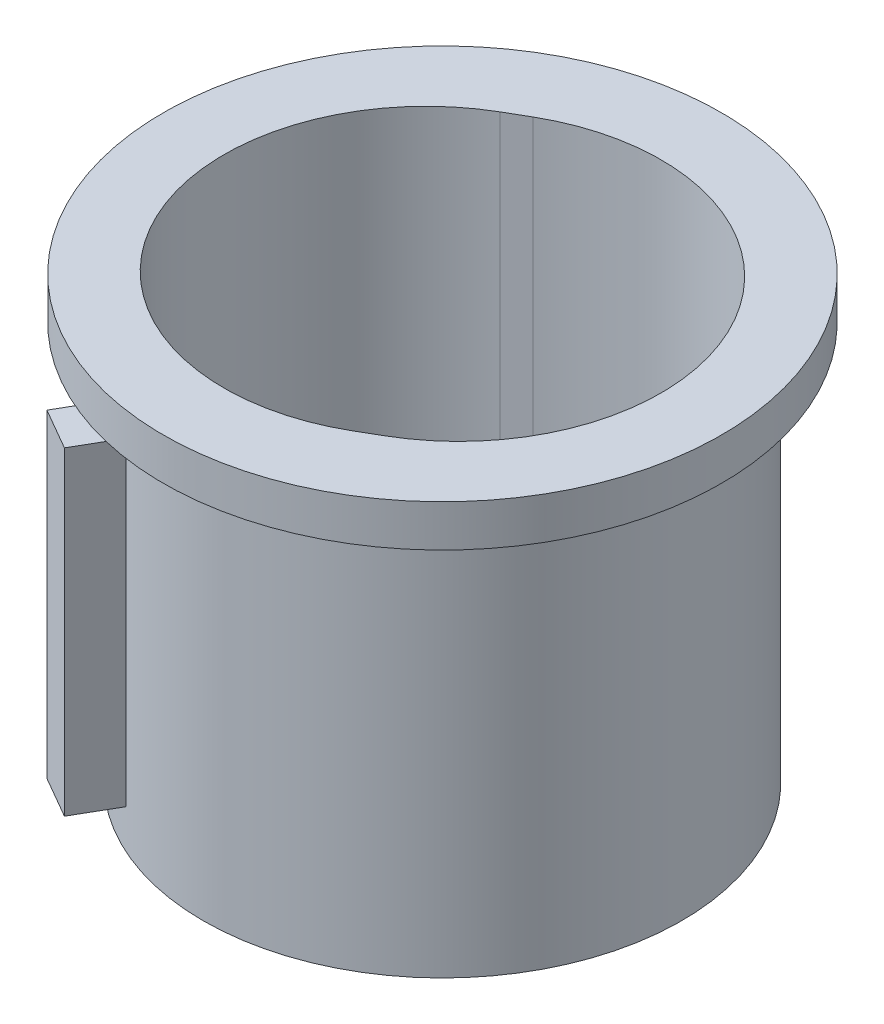
ISO-10303-21;
HEADER;
FILE_DESCRIPTION(('STEP AP214'),'2;1');
FILE_NAME('part.step','',(''),(''),'','','');
FILE_SCHEMA(('AUTOMOTIVE_DESIGN { 1 0 10303 214 1 1 1 1 }'));
ENDSEC;
DATA;
#1=APPLICATION_CONTEXT('core data for automotive mechanical design processes');
#2=APPLICATION_PROTOCOL_DEFINITION('international standard','automotive_design',2000,#1);
#3=PRODUCT_CONTEXT('',#1,'mechanical');
#4=PRODUCT('Part','Part','',(#3));
#5=PRODUCT_RELATED_PRODUCT_CATEGORY('part','',(#4));
#6=PRODUCT_DEFINITION_FORMATION('','',#4);
#7=PRODUCT_DEFINITION_CONTEXT('part definition',#1,'design');
#8=PRODUCT_DEFINITION('design','',#6,#7);
#9=PRODUCT_DEFINITION_SHAPE('','',#8);
#10=(LENGTH_UNIT() NAMED_UNIT(*) SI_UNIT(.MILLI.,.METRE.));
#11=(NAMED_UNIT(*) PLANE_ANGLE_UNIT() SI_UNIT($,.RADIAN.));
#12=(NAMED_UNIT(*) SI_UNIT($,.STERADIAN.) SOLID_ANGLE_UNIT());
#13=UNCERTAINTY_MEASURE_WITH_UNIT(LENGTH_MEASURE(1.E-05),#10,'distance_accuracy_value','');
#14=(GEOMETRIC_REPRESENTATION_CONTEXT(3) GLOBAL_UNCERTAINTY_ASSIGNED_CONTEXT((#13)) GLOBAL_UNIT_ASSIGNED_CONTEXT((#10,
#11,#12)) REPRESENTATION_CONTEXT('',''));
#15=CARTESIAN_POINT('',(0.,0.,0.));
#16=DIRECTION('',(0.,0.,1.));
#17=DIRECTION('',(1.,0.,0.));
#18=AXIS2_PLACEMENT_3D('',#15,#16,#17);
#19=CARTESIAN_POINT('',(-74.2916512459885,-105.98,31.1769145362398));
#20=DIRECTION('',(0.,1.,0.));
#21=DIRECTION('',(-0.866025403784439,0.,-0.5));
#22=AXIS2_PLACEMENT_3D('',#19,#20,#21);
#23=PLANE('',#22);
#24=CARTESIAN_POINT('',(-74.2916512459885,-105.98,31.1769145362398));
#25=DIRECTION('',(0.,1.,0.));
#26=DIRECTION('',(-0.866025403784439,0.,-0.5));
#27=AXIS2_PLACEMENT_3D('',#24,#25,#26);
#28=CIRCLE('',#27,6.);
#29=CARTESIAN_POINT('',(-79.4878036686952,-105.98,28.1769145362398));
#30=VERTEX_POINT('',#29);
#31=EDGE_CURVE('E159',#30,#30,#28,.T.);
#32=ORIENTED_EDGE('',*,*,#31,.F.);
#33=EDGE_LOOP('',(#32));
#34=FACE_BOUND('',#33,.T.);
#35=CARTESIAN_POINT('',(-74.0318436248532,-105.98,31.0269145362398));
#36=DIRECTION('',(0.,1.,0.));
#37=DIRECTION('',(-0.866025403784439,0.,-0.5));
#38=AXIS2_PLACEMENT_3D('',#35,#36,#37);
#39=CIRCLE('',#38,5.07);
#40=CARTESIAN_POINT('',(-76.5668436248532,-105.98,26.6361657390527));
#41=VERTEX_POINT('',#40);
#42=CARTESIAN_POINT('',(-71.4968436248532,-105.98,35.4176633334269));
#43=VERTEX_POINT('',#42);
#44=EDGE_CURVE('E146',#41,#43,#39,.F.);
#45=ORIENTED_EDGE('',*,*,#44,.F.);
#46=DIRECTION('',(0.866025403784439,0.,-0.499999999999999));
#47=VECTOR('',#46,1.);
#48=CARTESIAN_POINT('',(-76.8266512459885,-105.98,26.7861657390527));
#49=LINE('',#48,#47);
#50=CARTESIAN_POINT('',(-77.0864588671238,-105.98,26.9361657390527));
#51=VERTEX_POINT('',#50);
#52=EDGE_CURVE('E150',#51,#41,#49,.T.);
#53=ORIENTED_EDGE('',*,*,#52,.F.);
#54=CARTESIAN_POINT('',(-74.5514588671238,-105.98,31.3269145362398));
#55=DIRECTION('',(0.,1.,0.));
#56=DIRECTION('',(-0.866025403784439,0.,-0.5));
#57=AXIS2_PLACEMENT_3D('',#54,#55,#56);
#58=CIRCLE('',#57,5.07);
#59=CARTESIAN_POINT('',(-72.0164588671238,-105.98,35.7176633334269));
#60=VERTEX_POINT('',#59);
#61=EDGE_CURVE('E143',#60,#51,#58,.F.);
#62=ORIENTED_EDGE('',*,*,#61,.F.);
#63=DIRECTION('',(-0.866025403784439,0.,0.499999999999999));
#64=VECTOR('',#63,1.);
#65=CARTESIAN_POINT('',(-71.7566512459885,-105.98,35.5676633334269));
#66=LINE('',#65,#64);
#67=EDGE_CURVE('E141',#43,#60,#66,.T.);
#68=ORIENTED_EDGE('',*,*,#67,.F.);
#69=EDGE_LOOP('',(#45,#53,#62,#68));
#70=FACE_BOUND('',#69,.T.);
#71=ADVANCED_FACE('F41',(#34,#70),#23,.F.);
#72=CARTESIAN_POINT('',(-74.2916512459885,-94.93,31.1769145362398));
#73=DIRECTION('',(0.,1.,0.));
#74=DIRECTION('',(-0.866025403784439,0.,-0.5));
#75=AXIS2_PLACEMENT_3D('',#72,#73,#74);
#76=PLANE('',#75);
#77=CARTESIAN_POINT('',(-74.2916512459885,-94.93,31.1769145362398));
#78=DIRECTION('',(0.,1.,0.));
#79=DIRECTION('',(-0.866025403784439,0.,-0.5));
#80=AXIS2_PLACEMENT_3D('',#77,#78,#79);
#81=CIRCLE('',#80,7.);
#82=CARTESIAN_POINT('',(-80.3538290724796,-94.93,27.6769145362398));
#83=VERTEX_POINT('',#82);
#84=EDGE_CURVE('E155',#83,#83,#81,.T.);
#85=ORIENTED_EDGE('',*,*,#84,.T.);
#86=EDGE_LOOP('',(#85));
#87=FACE_BOUND('',#86,.T.);
#88=DIRECTION('',(0.866025403784439,0.,-0.499999999999999));
#89=VECTOR('',#88,1.);
#90=CARTESIAN_POINT('',(-76.8266512459885,-94.93,26.7861657390527));
#91=LINE('',#90,#89);
#92=CARTESIAN_POINT('',(-77.0864588671238,-94.93,26.9361657390527));
#93=VERTEX_POINT('',#92);
#94=CARTESIAN_POINT('',(-76.5668436248532,-94.93,26.6361657390527));
#95=VERTEX_POINT('',#94);
#96=EDGE_CURVE('E167',#93,#95,#91,.T.);
#97=ORIENTED_EDGE('',*,*,#96,.T.);
#98=CARTESIAN_POINT('',(-74.0318436248532,-94.93,31.0269145362398));
#99=DIRECTION('',(0.,1.,0.));
#100=DIRECTION('',(-0.866025403784439,0.,-0.5));
#101=AXIS2_PLACEMENT_3D('',#98,#99,#100);
#102=CIRCLE('',#101,5.07);
#103=CARTESIAN_POINT('',(-71.4968436248532,-94.93,35.4176633334269));
#104=VERTEX_POINT('',#103);
#105=EDGE_CURVE('E173',#95,#104,#102,.F.);
#106=ORIENTED_EDGE('',*,*,#105,.T.);
#107=DIRECTION('',(-0.866025403784439,0.,0.499999999999999));
#108=VECTOR('',#107,1.);
#109=CARTESIAN_POINT('',(-71.7566512459885,-94.93,35.5676633334269));
#110=LINE('',#109,#108);
#111=CARTESIAN_POINT('',(-72.0164588671238,-94.93,35.7176633334269));
#112=VERTEX_POINT('',#111);
#113=EDGE_CURVE('E162',#104,#112,#110,.T.);
#114=ORIENTED_EDGE('',*,*,#113,.T.);
#115=CARTESIAN_POINT('',(-74.5514588671238,-94.93,31.3269145362398));
#116=DIRECTION('',(0.,1.,0.));
#117=DIRECTION('',(-0.866025403784439,0.,-0.5));
#118=AXIS2_PLACEMENT_3D('',#115,#116,#117);
#119=CIRCLE('',#118,5.07);
#120=EDGE_CURVE('E170',#112,#93,#119,.F.);
#121=ORIENTED_EDGE('',*,*,#120,.T.);
#122=EDGE_LOOP('',(#97,#106,#114,#121));
#123=FACE_BOUND('',#122,.T.);
#124=ADVANCED_FACE('F189',(#87,#123),#76,.T.);
#125=CARTESIAN_POINT('',(-74.2916512459885,-95.98,31.1769145362398));
#126=DIRECTION('',(0.,-1.,0.));
#127=DIRECTION('',(0.866025403784439,0.,0.5));
#128=AXIS2_PLACEMENT_3D('',#125,#126,#127);
#129=CYLINDRICAL_SURFACE('',#128,6.);
#130=DIRECTION('',(0.,-1.,0.));
#131=VECTOR('',#130,1.);
#132=CARTESIAN_POINT('',(-77.796228799579,-95.98,36.047020918124));
#133=LINE('',#132,#131);
#134=CARTESIAN_POINT('',(-77.796228799579,-97.,36.047020918124));
#135=VERTEX_POINT('',#134);
#136=CARTESIAN_POINT('',(-77.796228799579,-105.,36.047020918124));
#137=VERTEX_POINT('',#136);
#138=EDGE_CURVE('E47',#135,#137,#133,.T.);
#139=ORIENTED_EDGE('',*,*,#138,.F.);
#140=CARTESIAN_POINT('',(-74.2916512459885,-97.,31.1769145362398));
#141=DIRECTION('',(0.,1.,0.));
#142=DIRECTION('',(-0.866025403784439,0.,-0.5));
#143=AXIS2_PLACEMENT_3D('',#140,#141,#142);
#144=CIRCLE('',#143,6.);
#145=CARTESIAN_POINT('',(-76.7569983150377,-97.,36.647020918124));
#146=VERTEX_POINT('',#145);
#147=EDGE_CURVE('E11',#135,#146,#144,.T.);
#148=ORIENTED_EDGE('',*,*,#147,.T.);
#149=DIRECTION('',(0.,-1.,0.));
#150=VECTOR('',#149,1.);
#151=CARTESIAN_POINT('',(-76.7569983150377,-95.98,36.647020918124));
#152=LINE('',#151,#150);
#153=CARTESIAN_POINT('',(-76.7569983150377,-105.,36.647020918124));
#154=VERTEX_POINT('',#153);
#155=EDGE_CURVE('E177',#154,#146,#152,.F.);
#156=ORIENTED_EDGE('',*,*,#155,.F.);
#157=CARTESIAN_POINT('',(-74.2916512459885,-105.,31.1769145362398));
#158=DIRECTION('',(0.,1.,0.));
#159=DIRECTION('',(-0.866025403784439,0.,-0.5));
#160=AXIS2_PLACEMENT_3D('',#157,#158,#159);
#161=CIRCLE('',#160,6.);
#162=EDGE_CURVE('E176',#137,#154,#161,.T.);
#163=ORIENTED_EDGE('',*,*,#162,.F.);
#164=EDGE_LOOP('',(#139,#148,#156,#163));
#165=FACE_BOUND('',#164,.T.);
#166=CARTESIAN_POINT('',(-74.2916512459885,-95.98,31.1769145362398));
#167=DIRECTION('',(0.,1.,0.));
#168=DIRECTION('',(-0.866025403784439,0.,-0.5));
#169=AXIS2_PLACEMENT_3D('',#166,#167,#168);
#170=CIRCLE('',#169,6.);
#171=CARTESIAN_POINT('',(-79.4878036686952,-95.98,28.1769145362398));
#172=VERTEX_POINT('',#171);
#173=EDGE_CURVE('E158',#172,#172,#170,.T.);
#174=ORIENTED_EDGE('',*,*,#173,.F.);
#175=EDGE_LOOP('',(#174));
#176=FACE_BOUND('',#175,.T.);
#177=ORIENTED_EDGE('',*,*,#31,.T.);
#178=EDGE_LOOP('',(#177));
#179=FACE_BOUND('',#178,.T.);
#180=ADVANCED_FACE('F43',(#165,#176,#179),#129,.T.);
#181=CARTESIAN_POINT('',(-74.2916512459885,-94.93,31.1769145362398));
#182=DIRECTION('',(0.,-1.,0.));
#183=DIRECTION('',(0.866025403784439,0.,0.5));
#184=AXIS2_PLACEMENT_3D('',#181,#182,#183);
#185=CYLINDRICAL_SURFACE('',#184,7.);
#186=ORIENTED_EDGE('',*,*,#84,.F.);
#187=EDGE_LOOP('',(#186));
#188=FACE_BOUND('',#187,.T.);
#189=CARTESIAN_POINT('',(-74.2916512459885,-95.98,31.1769145362398));
#190=DIRECTION('',(0.,1.,0.));
#191=DIRECTION('',(-0.866025403784439,0.,-0.5));
#192=AXIS2_PLACEMENT_3D('',#189,#190,#191);
#193=CIRCLE('',#192,7.);
#194=CARTESIAN_POINT('',(-80.3538290724796,-95.98,27.6769145362398));
#195=VERTEX_POINT('',#194);
#196=EDGE_CURVE('E151',#195,#195,#193,.T.);
#197=ORIENTED_EDGE('',*,*,#196,.T.);
#198=EDGE_LOOP('',(#197));
#199=FACE_BOUND('',#198,.T.);
#200=ADVANCED_FACE('F190',(#188,#199),#185,.T.);
#201=CARTESIAN_POINT('',(-74.2916512459885,-95.98,31.1769145362398));
#202=DIRECTION('',(0.,1.,0.));
#203=DIRECTION('',(-0.866025403784439,0.,-0.5));
#204=AXIS2_PLACEMENT_3D('',#201,#202,#203);
#205=PLANE('',#204);
#206=ORIENTED_EDGE('',*,*,#173,.T.);
#207=EDGE_LOOP('',(#206));
#208=FACE_BOUND('',#207,.T.);
#209=ORIENTED_EDGE('',*,*,#196,.F.);
#210=EDGE_LOOP('',(#209));
#211=FACE_BOUND('',#210,.T.);
#212=ADVANCED_FACE('F228',(#208,#211),#205,.F.);
#213=CARTESIAN_POINT('',(-74.0318436248532,-94.83,31.0269145362398));
#214=DIRECTION('',(0.,-1.,0.));
#215=DIRECTION('',(0.866025403784439,0.,0.5));
#216=AXIS2_PLACEMENT_3D('',#213,#214,#215);
#217=CYLINDRICAL_SURFACE('',#216,5.07);
#218=ORIENTED_EDGE('',*,*,#44,.T.);
#219=DIRECTION('',(0.,-1.,0.));
#220=VECTOR('',#219,1.);
#221=CARTESIAN_POINT('',(-71.4968436248532,-94.83,35.4176633334269));
#222=LINE('',#221,#220);
#223=EDGE_CURVE('E120',#104,#43,#222,.T.);
#224=ORIENTED_EDGE('',*,*,#223,.F.);
#225=ORIENTED_EDGE('',*,*,#105,.F.);
#226=DIRECTION('',(0.,-1.,0.));
#227=VECTOR('',#226,1.);
#228=CARTESIAN_POINT('',(-76.5668436248532,-94.83,26.6361657390527));
#229=LINE('',#228,#227);
#230=EDGE_CURVE('E137',#95,#41,#229,.T.);
#231=ORIENTED_EDGE('',*,*,#230,.T.);
#232=EDGE_LOOP('',(#218,#224,#225,#231));
#233=FACE_BOUND('',#232,.T.);
#234=ADVANCED_FACE('F204',(#233),#217,.F.);
#235=CARTESIAN_POINT('',(-76.5668436248532,-94.83,26.6361657390527));
#236=DIRECTION('',(0.499999999999999,0.,0.866025403784439));
#237=DIRECTION('',(0.866025403784439,0.,-0.499999999999999));
#238=AXIS2_PLACEMENT_3D('',#235,#236,#237);
#239=PLANE('',#238);
#240=ORIENTED_EDGE('',*,*,#52,.T.);
#241=ORIENTED_EDGE('',*,*,#230,.F.);
#242=ORIENTED_EDGE('',*,*,#96,.F.);
#243=DIRECTION('',(0.,-1.,0.));
#244=VECTOR('',#243,1.);
#245=CARTESIAN_POINT('',(-77.0864588671238,-94.83,26.9361657390527));
#246=LINE('',#245,#244);
#247=EDGE_CURVE('E136',#93,#51,#246,.T.);
#248=ORIENTED_EDGE('',*,*,#247,.T.);
#249=EDGE_LOOP('',(#240,#241,#242,#248));
#250=FACE_BOUND('',#249,.T.);
#251=ADVANCED_FACE('F203',(#250),#239,.T.);
#252=CARTESIAN_POINT('',(-74.5514588671238,-94.83,31.3269145362398));
#253=DIRECTION('',(0.,-1.,0.));
#254=DIRECTION('',(0.866025403784439,0.,0.5));
#255=AXIS2_PLACEMENT_3D('',#252,#253,#254);
#256=CYLINDRICAL_SURFACE('',#255,5.07);
#257=ORIENTED_EDGE('',*,*,#61,.T.);
#258=ORIENTED_EDGE('',*,*,#247,.F.);
#259=ORIENTED_EDGE('',*,*,#120,.F.);
#260=DIRECTION('',(0.,-1.,0.));
#261=VECTOR('',#260,1.);
#262=CARTESIAN_POINT('',(-72.0164588671238,-94.83,35.7176633334269));
#263=LINE('',#262,#261);
#264=EDGE_CURVE('E133',#112,#60,#263,.T.);
#265=ORIENTED_EDGE('',*,*,#264,.T.);
#266=EDGE_LOOP('',(#257,#258,#259,#265));
#267=FACE_BOUND('',#266,.T.);
#268=ADVANCED_FACE('F209',(#267),#256,.F.);
#269=CARTESIAN_POINT('',(-72.0164588671238,-94.83,35.7176633334269));
#270=DIRECTION('',(-0.499999999999999,0.,-0.866025403784439));
#271=DIRECTION('',(-0.866025403784439,0.,0.499999999999999));
#272=AXIS2_PLACEMENT_3D('',#269,#270,#271);
#273=PLANE('',#272);
#274=ORIENTED_EDGE('',*,*,#67,.T.);
#275=ORIENTED_EDGE('',*,*,#264,.F.);
#276=ORIENTED_EDGE('',*,*,#113,.F.);
#277=ORIENTED_EDGE('',*,*,#223,.T.);
#278=EDGE_LOOP('',(#274,#275,#276,#277));
#279=FACE_BOUND('',#278,.T.);
#280=ADVANCED_FACE('F212',(#279),#273,.T.);
#281=CARTESIAN_POINT('',(-77.7112664882592,-97.,35.8998618781895));
#282=DIRECTION('',(0.866025403784439,0.,0.5));
#283=DIRECTION('',(0.5,0.,-0.866025403784439));
#284=AXIS2_PLACEMENT_3D('',#281,#282,#283);
#285=PLANE('',#284);
#286=DIRECTION('',(-0.5,0.,0.866025403784439));
#287=VECTOR('',#286,1.);
#288=CARTESIAN_POINT('',(-77.7112664882592,-97.,35.8998618781895));
#289=LINE('',#288,#287);
#290=CARTESIAN_POINT('',(-78.3612664882592,-97.,37.0256949031093));
#291=VERTEX_POINT('',#290);
#292=EDGE_CURVE('E99',#135,#291,#289,.T.);
#293=ORIENTED_EDGE('',*,*,#292,.F.);
#294=ORIENTED_EDGE('',*,*,#138,.T.);
#295=DIRECTION('',(-0.5,0.,0.866025403784439));
#296=VECTOR('',#295,1.);
#297=CARTESIAN_POINT('',(-77.7112664882592,-105.,35.8998618781895));
#298=LINE('',#297,#296);
#299=CARTESIAN_POINT('',(-78.3612664882592,-105.,37.0256949031093));
#300=VERTEX_POINT('',#299);
#301=EDGE_CURVE('E112',#137,#300,#298,.T.);
#302=ORIENTED_EDGE('',*,*,#301,.T.);
#303=DIRECTION('',(0.,-1.,0.));
#304=VECTOR('',#303,1.);
#305=CARTESIAN_POINT('',(-78.3612664882592,-97.,37.0256949031093));
#306=LINE('',#305,#304);
#307=EDGE_CURVE('E111',#291,#300,#306,.T.);
#308=ORIENTED_EDGE('',*,*,#307,.F.);
#309=EDGE_LOOP('',(#293,#294,#302,#308));
#310=FACE_BOUND('',#309,.T.);
#311=ADVANCED_FACE('F115',(#310),#285,.F.);
#312=CARTESIAN_POINT('',(-77.3220360037179,-97.,37.6256949031093));
#313=DIRECTION('',(-0.866025403784439,0.,-0.5));
#314=DIRECTION('',(-0.5,0.,0.866025403784439));
#315=AXIS2_PLACEMENT_3D('',#312,#313,#314);
#316=PLANE('',#315);
#317=DIRECTION('',(0.5,0.,-0.866025403784439));
#318=VECTOR('',#317,1.);
#319=CARTESIAN_POINT('',(-77.3220360037179,-105.,37.6256949031093));
#320=LINE('',#319,#318);
#321=CARTESIAN_POINT('',(-77.3220360037179,-105.,37.6256949031093));
#322=VERTEX_POINT('',#321);
#323=EDGE_CURVE('E108',#322,#154,#320,.T.);
#324=ORIENTED_EDGE('',*,*,#323,.T.);
#325=ORIENTED_EDGE('',*,*,#155,.T.);
#326=DIRECTION('',(0.5,0.,-0.866025403784439));
#327=VECTOR('',#326,1.);
#328=CARTESIAN_POINT('',(-77.3220360037179,-97.,37.6256949031093));
#329=LINE('',#328,#327);
#330=CARTESIAN_POINT('',(-77.3220360037179,-97.,37.6256949031093));
#331=VERTEX_POINT('',#330);
#332=EDGE_CURVE('E124',#331,#146,#329,.T.);
#333=ORIENTED_EDGE('',*,*,#332,.F.);
#334=DIRECTION('',(0.,-1.,0.));
#335=VECTOR('',#334,1.);
#336=CARTESIAN_POINT('',(-77.3220360037179,-97.,37.6256949031093));
#337=LINE('',#336,#335);
#338=EDGE_CURVE('E117',#331,#322,#337,.T.);
#339=ORIENTED_EDGE('',*,*,#338,.T.);
#340=EDGE_LOOP('',(#324,#325,#333,#339));
#341=FACE_BOUND('',#340,.T.);
#342=ADVANCED_FACE('F183',(#341),#316,.F.);
#343=CARTESIAN_POINT('',(-78.3612664882592,-97.,37.0256949031093));
#344=DIRECTION('',(0.5,0.,-0.866025403784439));
#345=DIRECTION('',(-0.866025403784439,0.,-0.5));
#346=AXIS2_PLACEMENT_3D('',#343,#344,#345);
#347=PLANE('',#346);
#348=DIRECTION('',(0.866025403784439,0.,0.5));
#349=VECTOR('',#348,1.);
#350=CARTESIAN_POINT('',(-78.3612664882592,-105.,37.0256949031093));
#351=LINE('',#350,#349);
#352=EDGE_CURVE('E129',#300,#322,#351,.T.);
#353=ORIENTED_EDGE('',*,*,#352,.T.);
#354=ORIENTED_EDGE('',*,*,#338,.F.);
#355=DIRECTION('',(0.866025403784439,0.,0.5));
#356=VECTOR('',#355,1.);
#357=CARTESIAN_POINT('',(-78.3612664882592,-97.,37.0256949031093));
#358=LINE('',#357,#356);
#359=EDGE_CURVE('E102',#291,#331,#358,.T.);
#360=ORIENTED_EDGE('',*,*,#359,.F.);
#361=ORIENTED_EDGE('',*,*,#307,.T.);
#362=EDGE_LOOP('',(#353,#354,#360,#361));
#363=FACE_BOUND('',#362,.T.);
#364=ADVANCED_FACE('F119',(#363),#347,.F.);
#365=CARTESIAN_POINT('',(-84.4374768689828,-97.,48.75));
#366=DIRECTION('',(0.,1.,0.));
#367=DIRECTION('',(-0.866025403784439,0.,-0.5));
#368=AXIS2_PLACEMENT_3D('',#365,#366,#367);
#369=PLANE('',#368);
#370=ORIENTED_EDGE('',*,*,#147,.F.);
#371=ORIENTED_EDGE('',*,*,#292,.T.);
#372=ORIENTED_EDGE('',*,*,#359,.T.);
#373=ORIENTED_EDGE('',*,*,#332,.T.);
#374=EDGE_LOOP('',(#370,#371,#372,#373));
#375=FACE_BOUND('',#374,.T.);
#376=ADVANCED_FACE('F105',(#375),#369,.T.);
#377=CARTESIAN_POINT('',(-84.4374768689828,-105.,48.75));
#378=DIRECTION('',(0.,1.,0.));
#379=DIRECTION('',(-0.866025403784439,0.,-0.5));
#380=AXIS2_PLACEMENT_3D('',#377,#378,#379);
#381=PLANE('',#380);
#382=ORIENTED_EDGE('',*,*,#301,.F.);
#383=ORIENTED_EDGE('',*,*,#162,.T.);
#384=ORIENTED_EDGE('',*,*,#323,.F.);
#385=ORIENTED_EDGE('',*,*,#352,.F.);
#386=EDGE_LOOP('',(#382,#383,#384,#385));
#387=FACE_BOUND('',#386,.T.);
#388=ADVANCED_FACE('F181',(#387),#381,.F.);
#389=CLOSED_SHELL('',(#71,#124,#180,#200,#212,#234,#251,#268,#280,#311,#342,#364,#376,#388));
#390=MANIFOLD_SOLID_BREP('B2',#389);
#391=ADVANCED_BREP_SHAPE_REPRESENTATION('',(#18,#390),#14);
#392=SHAPE_DEFINITION_REPRESENTATION(#9,#391);
ENDSEC;
END-ISO-10303-21;
